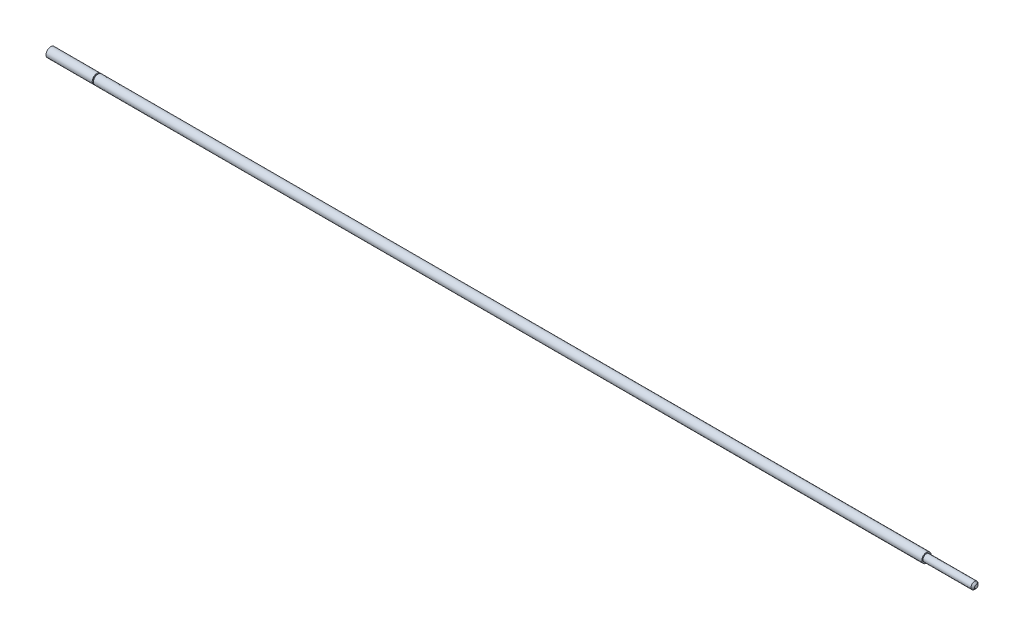
ISO-10303-21;
HEADER;
FILE_DESCRIPTION(('STEP AP214'),'2;1');
FILE_NAME('part.step','',(''),(''),'','','');
FILE_SCHEMA(('AUTOMOTIVE_DESIGN { 1 0 10303 214 1 1 1 1 }'));
ENDSEC;
DATA;
#1=APPLICATION_CONTEXT('core data for automotive mechanical design processes');
#2=APPLICATION_PROTOCOL_DEFINITION('international standard','automotive_design',2000,#1);
#3=PRODUCT_CONTEXT('',#1,'mechanical');
#4=PRODUCT('Part','Part','',(#3));
#5=PRODUCT_RELATED_PRODUCT_CATEGORY('part','',(#4));
#6=PRODUCT_DEFINITION_FORMATION('','',#4);
#7=PRODUCT_DEFINITION_CONTEXT('part definition',#1,'design');
#8=PRODUCT_DEFINITION('design','',#6,#7);
#9=PRODUCT_DEFINITION_SHAPE('','',#8);
#10=(LENGTH_UNIT() NAMED_UNIT(*) SI_UNIT(.MILLI.,.METRE.));
#11=(NAMED_UNIT(*) PLANE_ANGLE_UNIT() SI_UNIT($,.RADIAN.));
#12=(NAMED_UNIT(*) SI_UNIT($,.STERADIAN.) SOLID_ANGLE_UNIT());
#13=UNCERTAINTY_MEASURE_WITH_UNIT(LENGTH_MEASURE(1.E-05),#10,'distance_accuracy_value','');
#14=(GEOMETRIC_REPRESENTATION_CONTEXT(3) GLOBAL_UNCERTAINTY_ASSIGNED_CONTEXT((#13)) GLOBAL_UNIT_ASSIGNED_CONTEXT((#10,
#11,#12)) REPRESENTATION_CONTEXT('',''));
#15=CARTESIAN_POINT('',(0.,0.,0.));
#16=DIRECTION('',(0.,0.,1.));
#17=DIRECTION('',(1.,0.,0.));
#18=AXIS2_PLACEMENT_3D('',#15,#16,#17);
#19=CARTESIAN_POINT('',(748.,0.,0.));
#20=DIRECTION('',(1.,0.,0.));
#21=DIRECTION('',(0.,0.,-1.));
#22=AXIS2_PLACEMENT_3D('',#19,#20,#21);
#23=PLANE('',#22);
#24=CARTESIAN_POINT('',(748.,0.,0.));
#25=DIRECTION('',(1.,0.,0.));
#26=DIRECTION('',(0.,0.,-1.));
#27=AXIS2_PLACEMENT_3D('',#24,#25,#26);
#28=CIRCLE('',#27,4.);
#29=CARTESIAN_POINT('',(748.,0.,-4.));
#30=VERTEX_POINT('',#29);
#31=EDGE_CURVE('E144',#30,#30,#28,.T.);
#32=ORIENTED_EDGE('',*,*,#31,.T.);
#33=EDGE_LOOP('',(#32));
#34=FACE_BOUND('',#33,.T.);
#35=CARTESIAN_POINT('',(748.,0.,0.));
#36=DIRECTION('',(1.,0.,0.));
#37=DIRECTION('',(0.,0.,-1.));
#38=AXIS2_PLACEMENT_3D('',#35,#36,#37);
#39=CIRCLE('',#38,3.);
#40=CARTESIAN_POINT('',(748.,0.,-3.));
#41=VERTEX_POINT('',#40);
#42=EDGE_CURVE('E135',#41,#41,#39,.T.);
#43=ORIENTED_EDGE('',*,*,#42,.F.);
#44=EDGE_LOOP('',(#43));
#45=FACE_BOUND('',#44,.T.);
#46=ADVANCED_FACE('F33',(#34,#45),#23,.T.);
#47=CARTESIAN_POINT('',(39.5,0.,0.));
#48=DIRECTION('',(1.,0.,0.));
#49=DIRECTION('',(0.,0.,-1.));
#50=AXIS2_PLACEMENT_3D('',#47,#48,#49);
#51=PLANE('',#50);
#52=CARTESIAN_POINT('',(39.5,0.,0.));
#53=DIRECTION('',(1.,0.,0.));
#54=DIRECTION('',(0.,0.,-1.));
#55=AXIS2_PLACEMENT_3D('',#52,#53,#54);
#56=CIRCLE('',#55,4.);
#57=CARTESIAN_POINT('',(39.5,0.,-4.));
#58=VERTEX_POINT('',#57);
#59=EDGE_CURVE('E156',#58,#58,#56,.T.);
#60=ORIENTED_EDGE('',*,*,#59,.T.);
#61=EDGE_LOOP('',(#60));
#62=FACE_BOUND('',#61,.T.);
#63=CARTESIAN_POINT('',(39.5,0.,0.));
#64=DIRECTION('',(1.,0.,0.));
#65=DIRECTION('',(0.,0.,-1.));
#66=AXIS2_PLACEMENT_3D('',#63,#64,#65);
#67=CIRCLE('',#66,3.);
#68=CARTESIAN_POINT('',(39.5,0.,-3.));
#69=VERTEX_POINT('',#68);
#70=EDGE_CURVE('E147',#69,#69,#67,.T.);
#71=ORIENTED_EDGE('',*,*,#70,.F.);
#72=EDGE_LOOP('',(#71));
#73=FACE_BOUND('',#72,.T.);
#74=ADVANCED_FACE('F178',(#62,#73),#51,.T.);
#75=CARTESIAN_POINT('',(39.5,0.,0.));
#76=DIRECTION('',(-1.,0.,0.));
#77=DIRECTION('',(0.,0.,1.));
#78=AXIS2_PLACEMENT_3D('',#75,#76,#77);
#79=CYLINDRICAL_SURFACE('',#78,4.);
#80=ORIENTED_EDGE('',*,*,#59,.F.);
#81=EDGE_LOOP('',(#80));
#82=FACE_BOUND('',#81,.T.);
#83=CARTESIAN_POINT('',(0.,0.,0.));
#84=DIRECTION('',(1.,0.,0.));
#85=DIRECTION('',(0.,0.,-1.));
#86=AXIS2_PLACEMENT_3D('',#83,#84,#85);
#87=CIRCLE('',#86,4.);
#88=CARTESIAN_POINT('',(0.,0.,-4.));
#89=VERTEX_POINT('',#88);
#90=EDGE_CURVE('E153',#89,#89,#87,.T.);
#91=ORIENTED_EDGE('',*,*,#90,.T.);
#92=EDGE_LOOP('',(#91));
#93=FACE_BOUND('',#92,.T.);
#94=ADVANCED_FACE('F184',(#82,#93),#79,.T.);
#95=CARTESIAN_POINT('',(0.,0.,0.));
#96=DIRECTION('',(1.,0.,0.));
#97=DIRECTION('',(0.,0.,-1.));
#98=AXIS2_PLACEMENT_3D('',#95,#96,#97);
#99=PLANE('',#98);
#100=DIRECTION('',(0.,-1.,0.));
#101=VECTOR('',#100,1.);
#102=CARTESIAN_POINT('',(0.,1.375,-2.38156986040721));
#103=LINE('',#102,#101);
#104=CARTESIAN_POINT('',(0.,1.375,-2.38156986040721));
#105=VERTEX_POINT('',#104);
#106=CARTESIAN_POINT('',(0.,-1.375,-2.38156986040721));
#107=VERTEX_POINT('',#106);
#108=EDGE_CURVE('E122',#105,#107,#103,.T.);
#109=ORIENTED_EDGE('',*,*,#108,.F.);
#110=DIRECTION('',(0.,-0.5,-0.866025403784439));
#111=VECTOR('',#110,1.);
#112=CARTESIAN_POINT('',(0.,2.75,0.));
#113=LINE('',#112,#111);
#114=CARTESIAN_POINT('',(0.,2.75,0.));
#115=VERTEX_POINT('',#114);
#116=EDGE_CURVE('E48',#115,#105,#113,.T.);
#117=ORIENTED_EDGE('',*,*,#116,.F.);
#118=DIRECTION('',(0.,0.5,-0.866025403784439));
#119=VECTOR('',#118,1.);
#120=CARTESIAN_POINT('',(0.,1.375,2.38156986040721));
#121=LINE('',#120,#119);
#122=CARTESIAN_POINT('',(0.,1.375,2.38156986040721));
#123=VERTEX_POINT('',#122);
#124=EDGE_CURVE('E131',#123,#115,#121,.T.);
#125=ORIENTED_EDGE('',*,*,#124,.F.);
#126=DIRECTION('',(0.,1.,0.));
#127=VECTOR('',#126,1.);
#128=CARTESIAN_POINT('',(0.,-1.375,2.38156986040721));
#129=LINE('',#128,#127);
#130=CARTESIAN_POINT('',(0.,-1.375,2.38156986040721));
#131=VERTEX_POINT('',#130);
#132=EDGE_CURVE('E129',#131,#123,#129,.T.);
#133=ORIENTED_EDGE('',*,*,#132,.F.);
#134=DIRECTION('',(0.,0.5,0.866025403784439));
#135=VECTOR('',#134,1.);
#136=CARTESIAN_POINT('',(0.,-2.75,0.));
#137=LINE('',#136,#135);
#138=CARTESIAN_POINT('',(0.,-2.75,0.));
#139=VERTEX_POINT('',#138);
#140=EDGE_CURVE('E96',#139,#131,#137,.T.);
#141=ORIENTED_EDGE('',*,*,#140,.F.);
#142=DIRECTION('',(0.,-0.5,0.866025403784439));
#143=VECTOR('',#142,1.);
#144=CARTESIAN_POINT('',(0.,-1.375,-2.38156986040721));
#145=LINE('',#144,#143);
#146=EDGE_CURVE('E125',#107,#139,#145,.T.);
#147=ORIENTED_EDGE('',*,*,#146,.F.);
#148=EDGE_LOOP('',(#109,#117,#125,#133,#141,#147));
#149=FACE_BOUND('',#148,.T.);
#150=ORIENTED_EDGE('',*,*,#90,.F.);
#151=EDGE_LOOP('',(#150));
#152=FACE_BOUND('',#151,.T.);
#153=ADVANCED_FACE('F200',(#149,#152),#99,.F.);
#154=CARTESIAN_POINT('',(40.5,0.,0.));
#155=DIRECTION('',(-1.,0.,0.));
#156=DIRECTION('',(0.,0.,1.));
#157=AXIS2_PLACEMENT_3D('',#154,#155,#156);
#158=CYLINDRICAL_SURFACE('',#157,3.);
#159=CARTESIAN_POINT('',(40.5,0.,0.));
#160=DIRECTION('',(1.,0.,0.));
#161=DIRECTION('',(0.,0.,-1.));
#162=AXIS2_PLACEMENT_3D('',#159,#160,#161);
#163=CIRCLE('',#162,3.);
#164=CARTESIAN_POINT('',(40.5,0.,-3.));
#165=VERTEX_POINT('',#164);
#166=EDGE_CURVE('E150',#165,#165,#163,.T.);
#167=ORIENTED_EDGE('',*,*,#166,.F.);
#168=EDGE_LOOP('',(#167));
#169=FACE_BOUND('',#168,.T.);
#170=ORIENTED_EDGE('',*,*,#70,.T.);
#171=EDGE_LOOP('',(#170));
#172=FACE_BOUND('',#171,.T.);
#173=ADVANCED_FACE('F194',(#169,#172),#158,.T.);
#174=CARTESIAN_POINT('',(40.5,0.,0.));
#175=DIRECTION('',(1.,0.,0.));
#176=DIRECTION('',(0.,0.,-1.));
#177=AXIS2_PLACEMENT_3D('',#174,#175,#176);
#178=PLANE('',#177);
#179=CARTESIAN_POINT('',(40.5,0.,0.));
#180=DIRECTION('',(1.,0.,0.));
#181=DIRECTION('',(0.,0.,-1.));
#182=AXIS2_PLACEMENT_3D('',#179,#180,#181);
#183=CIRCLE('',#182,4.);
#184=CARTESIAN_POINT('',(40.5,0.,-4.));
#185=VERTEX_POINT('',#184);
#186=EDGE_CURVE('E143',#185,#185,#183,.T.);
#187=ORIENTED_EDGE('',*,*,#186,.F.);
#188=EDGE_LOOP('',(#187));
#189=FACE_BOUND('',#188,.T.);
#190=ORIENTED_EDGE('',*,*,#166,.T.);
#191=EDGE_LOOP('',(#190));
#192=FACE_BOUND('',#191,.T.);
#193=ADVANCED_FACE('F190',(#189,#192),#178,.F.);
#194=CARTESIAN_POINT('',(748.,0.,0.));
#195=DIRECTION('',(-1.,0.,0.));
#196=DIRECTION('',(0.,0.,1.));
#197=AXIS2_PLACEMENT_3D('',#194,#195,#196);
#198=CYLINDRICAL_SURFACE('',#197,4.);
#199=ORIENTED_EDGE('',*,*,#31,.F.);
#200=EDGE_LOOP('',(#199));
#201=FACE_BOUND('',#200,.T.);
#202=ORIENTED_EDGE('',*,*,#186,.T.);
#203=EDGE_LOOP('',(#202));
#204=FACE_BOUND('',#203,.T.);
#205=ADVANCED_FACE('F193',(#201,#204),#198,.T.);
#206=CARTESIAN_POINT('',(790.5,0.,0.));
#207=DIRECTION('',(-1.,0.,0.));
#208=DIRECTION('',(0.,0.,1.));
#209=AXIS2_PLACEMENT_3D('',#206,#207,#208);
#210=CYLINDRICAL_SURFACE('',#209,3.);
#211=CARTESIAN_POINT('',(789.,0.,0.));
#212=DIRECTION('',(1.,0.,0.));
#213=DIRECTION('',(0.,0.,-1.));
#214=AXIS2_PLACEMENT_3D('',#211,#212,#213);
#215=CIRCLE('',#214,3.);
#216=CARTESIAN_POINT('',(789.,0.,-3.));
#217=VERTEX_POINT('',#216);
#218=EDGE_CURVE('E11',#217,#217,#215,.F.);
#219=ORIENTED_EDGE('',*,*,#218,.T.);
#220=EDGE_LOOP('',(#219));
#221=FACE_BOUND('',#220,.T.);
#222=ORIENTED_EDGE('',*,*,#42,.T.);
#223=EDGE_LOOP('',(#222));
#224=FACE_BOUND('',#223,.T.);
#225=ADVANCED_FACE('F174',(#221,#224),#210,.T.);
#226=CARTESIAN_POINT('',(790.5,0.,0.));
#227=DIRECTION('',(1.,0.,0.));
#228=DIRECTION('',(0.,0.,-1.));
#229=AXIS2_PLACEMENT_3D('',#226,#227,#228);
#230=PLANE('',#229);
#231=CARTESIAN_POINT('',(790.5,0.,0.));
#232=DIRECTION('',(1.,0.,0.));
#233=DIRECTION('',(0.,0.,-1.));
#234=AXIS2_PLACEMENT_3D('',#231,#232,#233);
#235=CIRCLE('',#234,1.49999999999995);
#236=CARTESIAN_POINT('',(790.5,0.,-1.49999999999995));
#237=VERTEX_POINT('',#236);
#238=EDGE_CURVE('E41',#237,#237,#235,.T.);
#239=ORIENTED_EDGE('',*,*,#238,.T.);
#240=EDGE_LOOP('',(#239));
#241=FACE_BOUND('',#240,.T.);
#242=ADVANCED_FACE('F163',(#241),#230,.T.);
#243=CARTESIAN_POINT('',(790.5,0.,0.));
#244=DIRECTION('',(-1.,0.,0.));
#245=DIRECTION('',(0.,0.,1.));
#246=AXIS2_PLACEMENT_3D('',#243,#244,#245);
#247=CONICAL_SURFACE('',#246,1.49999999999995,0.785398163397448);
#248=ORIENTED_EDGE('',*,*,#218,.F.);
#249=EDGE_LOOP('',(#248));
#250=FACE_BOUND('',#249,.T.);
#251=ORIENTED_EDGE('',*,*,#238,.F.);
#252=EDGE_LOOP('',(#251));
#253=FACE_BOUND('',#252,.T.);
#254=ADVANCED_FACE('F35',(#250,#253),#247,.T.);
#255=CARTESIAN_POINT('',(5.,2.75,0.));
#256=DIRECTION('',(0.,0.866025403784439,-0.5));
#257=DIRECTION('',(0.,0.5,0.866025403784439));
#258=AXIS2_PLACEMENT_3D('',#255,#256,#257);
#259=PLANE('',#258);
#260=ORIENTED_EDGE('',*,*,#116,.T.);
#261=DIRECTION('',(-1.,0.,0.));
#262=VECTOR('',#261,1.);
#263=CARTESIAN_POINT('',(5.,1.375,-2.38156986040721));
#264=LINE('',#263,#262);
#265=CARTESIAN_POINT('',(5.,1.375,-2.38156986040721));
#266=VERTEX_POINT('',#265);
#267=EDGE_CURVE('E78',#266,#105,#264,.T.);
#268=ORIENTED_EDGE('',*,*,#267,.F.);
#269=DIRECTION('',(0.,-0.5,-0.866025403784439));
#270=VECTOR('',#269,1.);
#271=CARTESIAN_POINT('',(5.,2.75,0.));
#272=LINE('',#271,#270);
#273=CARTESIAN_POINT('',(5.,2.75,0.));
#274=VERTEX_POINT('',#273);
#275=EDGE_CURVE('E133',#274,#266,#272,.T.);
#276=ORIENTED_EDGE('',*,*,#275,.F.);
#277=DIRECTION('',(-1.,0.,0.));
#278=VECTOR('',#277,1.);
#279=CARTESIAN_POINT('',(5.,2.75,0.));
#280=LINE('',#279,#278);
#281=EDGE_CURVE('E56',#274,#115,#280,.T.);
#282=ORIENTED_EDGE('',*,*,#281,.T.);
#283=EDGE_LOOP('',(#260,#268,#276,#282));
#284=FACE_BOUND('',#283,.T.);
#285=ADVANCED_FACE('F166',(#284),#259,.F.);
#286=CARTESIAN_POINT('',(5.,1.375,2.38156986040721));
#287=DIRECTION('',(0.,0.866025403784439,0.5));
#288=DIRECTION('',(0.,-0.5,0.866025403784439));
#289=AXIS2_PLACEMENT_3D('',#286,#287,#288);
#290=PLANE('',#289);
#291=ORIENTED_EDGE('',*,*,#124,.T.);
#292=ORIENTED_EDGE('',*,*,#281,.F.);
#293=DIRECTION('',(0.,0.5,-0.866025403784439));
#294=VECTOR('',#293,1.);
#295=CARTESIAN_POINT('',(5.,1.375,2.38156986040721));
#296=LINE('',#295,#294);
#297=CARTESIAN_POINT('',(5.,1.375,2.38156986040721));
#298=VERTEX_POINT('',#297);
#299=EDGE_CURVE('E108',#298,#274,#296,.T.);
#300=ORIENTED_EDGE('',*,*,#299,.F.);
#301=DIRECTION('',(-1.,0.,0.));
#302=VECTOR('',#301,1.);
#303=CARTESIAN_POINT('',(5.,1.375,2.38156986040721));
#304=LINE('',#303,#302);
#305=EDGE_CURVE('E100',#298,#123,#304,.T.);
#306=ORIENTED_EDGE('',*,*,#305,.T.);
#307=EDGE_LOOP('',(#291,#292,#300,#306));
#308=FACE_BOUND('',#307,.T.);
#309=ADVANCED_FACE('F172',(#308),#290,.F.);
#310=CARTESIAN_POINT('',(5.,-1.375,2.38156986040721));
#311=DIRECTION('',(0.,0.,1.));
#312=DIRECTION('',(1.,0.,0.));
#313=AXIS2_PLACEMENT_3D('',#310,#311,#312);
#314=PLANE('',#313);
#315=ORIENTED_EDGE('',*,*,#132,.T.);
#316=ORIENTED_EDGE('',*,*,#305,.F.);
#317=DIRECTION('',(0.,1.,0.));
#318=VECTOR('',#317,1.);
#319=CARTESIAN_POINT('',(5.,-1.375,2.38156986040721));
#320=LINE('',#319,#318);
#321=CARTESIAN_POINT('',(5.,-1.375,2.38156986040721));
#322=VERTEX_POINT('',#321);
#323=EDGE_CURVE('E104',#322,#298,#320,.T.);
#324=ORIENTED_EDGE('',*,*,#323,.F.);
#325=DIRECTION('',(-1.,0.,0.));
#326=VECTOR('',#325,1.);
#327=CARTESIAN_POINT('',(5.,-1.375,2.38156986040721));
#328=LINE('',#327,#326);
#329=EDGE_CURVE('E89',#322,#131,#328,.T.);
#330=ORIENTED_EDGE('',*,*,#329,.T.);
#331=EDGE_LOOP('',(#315,#316,#324,#330));
#332=FACE_BOUND('',#331,.T.);
#333=ADVANCED_FACE('F105',(#332),#314,.F.);
#334=CARTESIAN_POINT('',(5.,-2.75,0.));
#335=DIRECTION('',(0.,-0.866025403784439,0.5));
#336=DIRECTION('',(0.,-0.5,-0.866025403784439));
#337=AXIS2_PLACEMENT_3D('',#334,#335,#336);
#338=PLANE('',#337);
#339=ORIENTED_EDGE('',*,*,#140,.T.);
#340=ORIENTED_EDGE('',*,*,#329,.F.);
#341=DIRECTION('',(0.,0.5,0.866025403784439));
#342=VECTOR('',#341,1.);
#343=CARTESIAN_POINT('',(5.,-2.75,0.));
#344=LINE('',#343,#342);
#345=CARTESIAN_POINT('',(5.,-2.75,0.));
#346=VERTEX_POINT('',#345);
#347=EDGE_CURVE('E93',#346,#322,#344,.T.);
#348=ORIENTED_EDGE('',*,*,#347,.F.);
#349=DIRECTION('',(-1.,0.,0.));
#350=VECTOR('',#349,1.);
#351=CARTESIAN_POINT('',(5.,-2.75,0.));
#352=LINE('',#351,#350);
#353=EDGE_CURVE('E101',#346,#139,#352,.T.);
#354=ORIENTED_EDGE('',*,*,#353,.T.);
#355=EDGE_LOOP('',(#339,#340,#348,#354));
#356=FACE_BOUND('',#355,.T.);
#357=ADVANCED_FACE('F91',(#356),#338,.F.);
#358=CARTESIAN_POINT('',(5.,-1.375,-2.38156986040721));
#359=DIRECTION('',(0.,-0.866025403784439,-0.5));
#360=DIRECTION('',(0.,0.5,-0.866025403784439));
#361=AXIS2_PLACEMENT_3D('',#358,#359,#360);
#362=PLANE('',#361);
#363=ORIENTED_EDGE('',*,*,#146,.T.);
#364=ORIENTED_EDGE('',*,*,#353,.F.);
#365=DIRECTION('',(0.,-0.5,0.866025403784439));
#366=VECTOR('',#365,1.);
#367=CARTESIAN_POINT('',(5.,-1.375,-2.38156986040721));
#368=LINE('',#367,#366);
#369=CARTESIAN_POINT('',(5.,-1.375,-2.38156986040721));
#370=VERTEX_POINT('',#369);
#371=EDGE_CURVE('E114',#370,#346,#368,.T.);
#372=ORIENTED_EDGE('',*,*,#371,.F.);
#373=DIRECTION('',(-1.,0.,0.));
#374=VECTOR('',#373,1.);
#375=CARTESIAN_POINT('',(5.,-1.375,-2.38156986040721));
#376=LINE('',#375,#374);
#377=EDGE_CURVE('E138',#370,#107,#376,.T.);
#378=ORIENTED_EDGE('',*,*,#377,.T.);
#379=EDGE_LOOP('',(#363,#364,#372,#378));
#380=FACE_BOUND('',#379,.T.);
#381=ADVANCED_FACE('F277',(#380),#362,.F.);
#382=CARTESIAN_POINT('',(5.,1.375,-2.38156986040721));
#383=DIRECTION('',(0.,0.,-1.));
#384=DIRECTION('',(-1.,0.,0.));
#385=AXIS2_PLACEMENT_3D('',#382,#383,#384);
#386=PLANE('',#385);
#387=ORIENTED_EDGE('',*,*,#108,.T.);
#388=ORIENTED_EDGE('',*,*,#377,.F.);
#389=DIRECTION('',(0.,-1.,0.));
#390=VECTOR('',#389,1.);
#391=CARTESIAN_POINT('',(5.,1.375,-2.38156986040721));
#392=LINE('',#391,#390);
#393=EDGE_CURVE('E116',#266,#370,#392,.T.);
#394=ORIENTED_EDGE('',*,*,#393,.F.);
#395=ORIENTED_EDGE('',*,*,#267,.T.);
#396=EDGE_LOOP('',(#387,#388,#394,#395));
#397=FACE_BOUND('',#396,.T.);
#398=ADVANCED_FACE('F285',(#397),#386,.F.);
#399=CARTESIAN_POINT('',(5.,0.,0.));
#400=DIRECTION('',(-1.,0.,0.));
#401=DIRECTION('',(0.,0.,1.));
#402=AXIS2_PLACEMENT_3D('',#399,#400,#401);
#403=PLANE('',#402);
#404=ORIENTED_EDGE('',*,*,#275,.T.);
#405=ORIENTED_EDGE('',*,*,#393,.T.);
#406=ORIENTED_EDGE('',*,*,#371,.T.);
#407=ORIENTED_EDGE('',*,*,#347,.T.);
#408=ORIENTED_EDGE('',*,*,#323,.T.);
#409=ORIENTED_EDGE('',*,*,#299,.T.);
#410=EDGE_LOOP('',(#404,#405,#406,#407,#408,#409));
#411=FACE_BOUND('',#410,.T.);
#412=ADVANCED_FACE('F111',(#411),#403,.T.);
#413=CLOSED_SHELL('',(#46,#74,#94,#153,#173,#193,#205,#225,#242,#254,#285,#309,#333,#357,#381,
#398,#412));
#414=MANIFOLD_SOLID_BREP('B2',#413);
#415=ADVANCED_BREP_SHAPE_REPRESENTATION('',(#18,#414),#14);
#416=SHAPE_DEFINITION_REPRESENTATION(#9,#415);
ENDSEC;
END-ISO-10303-21;
